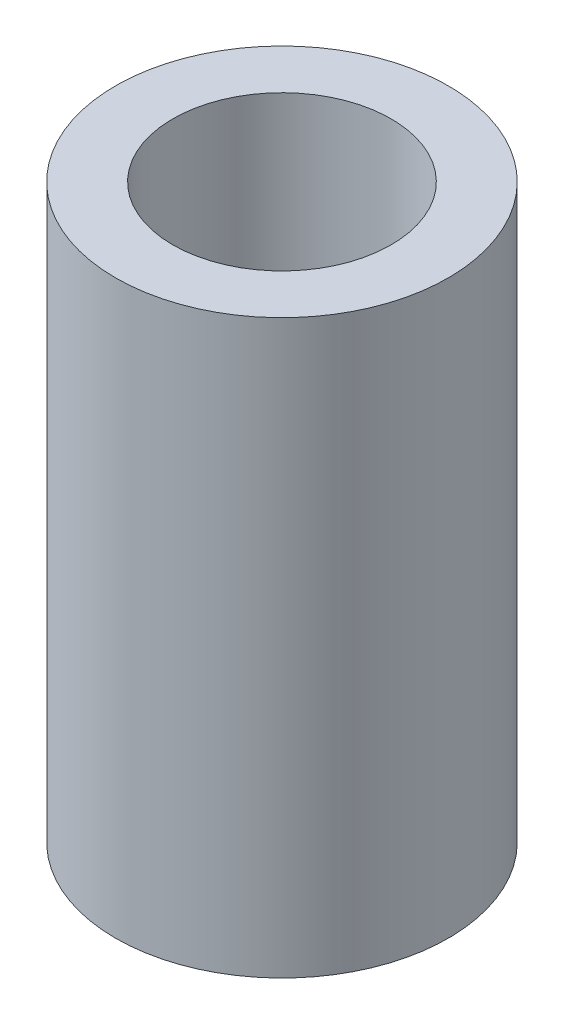
ISO-10303-21;
HEADER;
FILE_DESCRIPTION(('STEP AP214'),'2;1');
FILE_NAME('part.step','',(''),(''),'','','');
FILE_SCHEMA(('AUTOMOTIVE_DESIGN { 1 0 10303 214 1 1 1 1 }'));
ENDSEC;
DATA;
#1=APPLICATION_CONTEXT('core data for automotive mechanical design processes');
#2=APPLICATION_PROTOCOL_DEFINITION('international standard','automotive_design',2000,#1);
#3=PRODUCT_CONTEXT('',#1,'mechanical');
#4=PRODUCT('Part','Part','',(#3));
#5=PRODUCT_RELATED_PRODUCT_CATEGORY('part','',(#4));
#6=PRODUCT_DEFINITION_FORMATION('','',#4);
#7=PRODUCT_DEFINITION_CONTEXT('part definition',#1,'design');
#8=PRODUCT_DEFINITION('design','',#6,#7);
#9=PRODUCT_DEFINITION_SHAPE('','',#8);
#10=(LENGTH_UNIT() NAMED_UNIT(*) SI_UNIT(.MILLI.,.METRE.));
#11=(NAMED_UNIT(*) PLANE_ANGLE_UNIT() SI_UNIT($,.RADIAN.));
#12=(NAMED_UNIT(*) SI_UNIT($,.STERADIAN.) SOLID_ANGLE_UNIT());
#13=UNCERTAINTY_MEASURE_WITH_UNIT(LENGTH_MEASURE(1.E-05),#10,'distance_accuracy_value','');
#14=(GEOMETRIC_REPRESENTATION_CONTEXT(3) GLOBAL_UNCERTAINTY_ASSIGNED_CONTEXT((#13)) GLOBAL_UNIT_ASSIGNED_CONTEXT((#10,
#11,#12)) REPRESENTATION_CONTEXT('',''));
#15=CARTESIAN_POINT('',(0.,0.,0.));
#16=DIRECTION('',(0.,0.,1.));
#17=DIRECTION('',(1.,0.,0.));
#18=AXIS2_PLACEMENT_3D('',#15,#16,#17);
#19=CARTESIAN_POINT('',(0.,13.97,0.));
#20=DIRECTION('',(0.,1.,0.));
#21=DIRECTION('',(0.,0.,1.));
#22=AXIS2_PLACEMENT_3D('',#19,#20,#21);
#23=PLANE('',#22);
#24=CARTESIAN_POINT('',(0.,13.97,0.));
#25=DIRECTION('',(0.,1.,0.));
#26=DIRECTION('',(0.,0.,1.));
#27=AXIS2_PLACEMENT_3D('',#24,#25,#26);
#28=CIRCLE('',#27,4.064);
#29=CARTESIAN_POINT('',(0.,13.97,4.064));
#30=VERTEX_POINT('',#29);
#31=EDGE_CURVE('E10',#30,#30,#28,.T.);
#32=ORIENTED_EDGE('',*,*,#31,.T.);
#33=EDGE_LOOP('',(#32));
#34=FACE_BOUND('',#33,.T.);
#35=CARTESIAN_POINT('',(0.,13.97,0.));
#36=DIRECTION('',(0.,1.,0.));
#37=DIRECTION('',(0.,0.,1.));
#38=AXIS2_PLACEMENT_3D('',#35,#36,#37);
#39=CIRCLE('',#38,2.667);
#40=CARTESIAN_POINT('',(0.,13.97,2.667));
#41=VERTEX_POINT('',#40);
#42=EDGE_CURVE('E46',#41,#41,#39,.T.);
#43=ORIENTED_EDGE('',*,*,#42,.F.);
#44=EDGE_LOOP('',(#43));
#45=FACE_BOUND('',#44,.T.);
#46=ADVANCED_FACE('F35',(#34,#45),#23,.T.);
#47=CARTESIAN_POINT('',(0.,0.,0.));
#48=DIRECTION('',(0.,1.,0.));
#49=DIRECTION('',(0.,0.,1.));
#50=AXIS2_PLACEMENT_3D('',#47,#48,#49);
#51=PLANE('',#50);
#52=CARTESIAN_POINT('',(0.,0.,0.));
#53=DIRECTION('',(0.,1.,0.));
#54=DIRECTION('',(0.,0.,1.));
#55=AXIS2_PLACEMENT_3D('',#52,#53,#54);
#56=CIRCLE('',#55,4.064);
#57=CARTESIAN_POINT('',(0.,0.,4.064));
#58=VERTEX_POINT('',#57);
#59=EDGE_CURVE('E39',#58,#58,#56,.T.);
#60=ORIENTED_EDGE('',*,*,#59,.F.);
#61=EDGE_LOOP('',(#60));
#62=FACE_BOUND('',#61,.T.);
#63=CARTESIAN_POINT('',(0.,0.,0.));
#64=DIRECTION('',(0.,1.,0.));
#65=DIRECTION('',(0.,0.,1.));
#66=AXIS2_PLACEMENT_3D('',#63,#64,#65);
#67=CIRCLE('',#66,2.667);
#68=CARTESIAN_POINT('',(0.,0.,2.667));
#69=VERTEX_POINT('',#68);
#70=EDGE_CURVE('E48',#69,#69,#67,.T.);
#71=ORIENTED_EDGE('',*,*,#70,.T.);
#72=EDGE_LOOP('',(#71));
#73=FACE_BOUND('',#72,.T.);
#74=ADVANCED_FACE('F58',(#62,#73),#51,.F.);
#75=CARTESIAN_POINT('',(0.,13.97,0.));
#76=DIRECTION('',(0.,-1.,0.));
#77=DIRECTION('',(0.,0.,-1.));
#78=AXIS2_PLACEMENT_3D('',#75,#76,#77);
#79=CYLINDRICAL_SURFACE('',#78,4.064);
#80=ORIENTED_EDGE('',*,*,#31,.F.);
#81=EDGE_LOOP('',(#80));
#82=FACE_BOUND('',#81,.T.);
#83=ORIENTED_EDGE('',*,*,#59,.T.);
#84=EDGE_LOOP('',(#83));
#85=FACE_BOUND('',#84,.T.);
#86=ADVANCED_FACE('F37',(#82,#85),#79,.T.);
#87=CARTESIAN_POINT('',(0.,13.97,0.));
#88=DIRECTION('',(0.,-1.,0.));
#89=DIRECTION('',(0.,0.,-1.));
#90=AXIS2_PLACEMENT_3D('',#87,#88,#89);
#91=CYLINDRICAL_SURFACE('',#90,2.667);
#92=ORIENTED_EDGE('',*,*,#42,.T.);
#93=EDGE_LOOP('',(#92));
#94=FACE_BOUND('',#93,.T.);
#95=ORIENTED_EDGE('',*,*,#70,.F.);
#96=EDGE_LOOP('',(#95));
#97=FACE_BOUND('',#96,.T.);
#98=ADVANCED_FACE('F54',(#94,#97),#91,.F.);
#99=CLOSED_SHELL('',(#46,#74,#86,#98));
#100=MANIFOLD_SOLID_BREP('B2',#99);
#101=ADVANCED_BREP_SHAPE_REPRESENTATION('',(#18,#100),#14);
#102=SHAPE_DEFINITION_REPRESENTATION(#9,#101);
ENDSEC;
END-ISO-10303-21;
